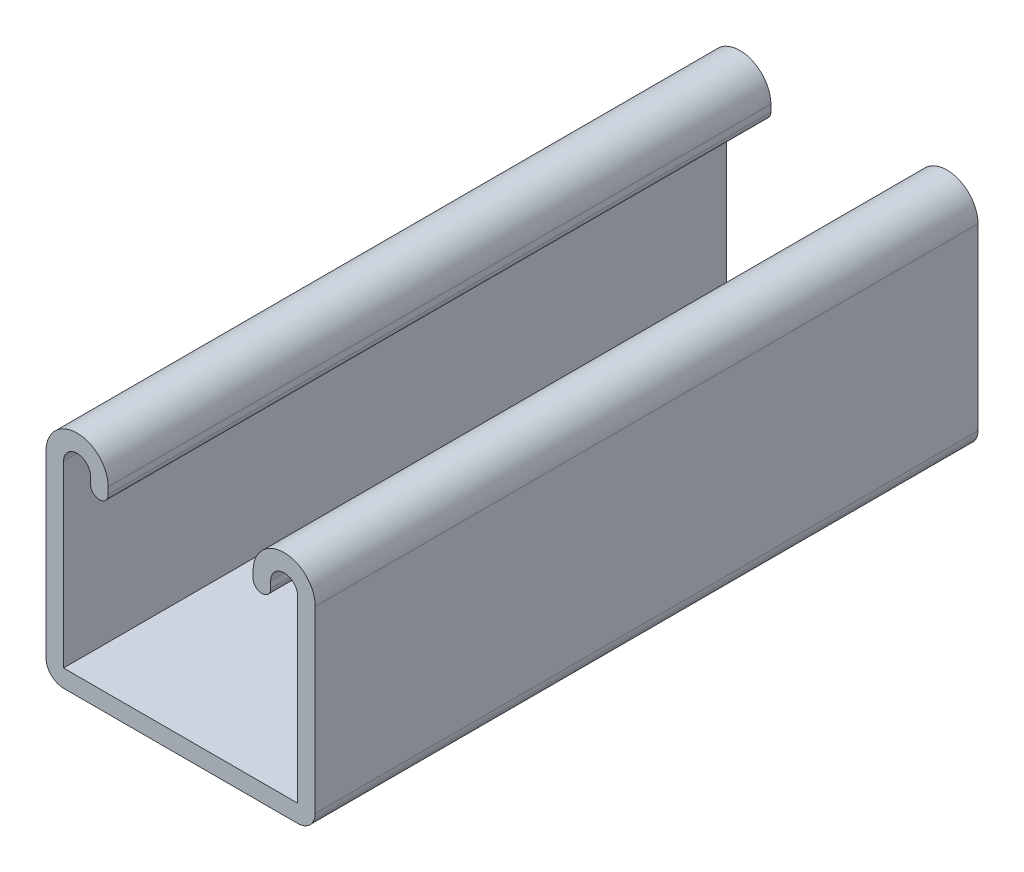
ISO-10303-21;
HEADER;
FILE_DESCRIPTION(('STEP AP214'),'2;1');
FILE_NAME('part.step','',(''),(''),'','','');
FILE_SCHEMA(('AUTOMOTIVE_DESIGN { 1 0 10303 214 1 1 1 1 }'));
ENDSEC;
DATA;
#1=APPLICATION_CONTEXT('core data for automotive mechanical design processes');
#2=APPLICATION_PROTOCOL_DEFINITION('international standard','automotive_design',2000,#1);
#3=PRODUCT_CONTEXT('',#1,'mechanical');
#4=PRODUCT('Part','Part','',(#3));
#5=PRODUCT_RELATED_PRODUCT_CATEGORY('part','',(#4));
#6=PRODUCT_DEFINITION_FORMATION('','',#4);
#7=PRODUCT_DEFINITION_CONTEXT('part definition',#1,'design');
#8=PRODUCT_DEFINITION('design','',#6,#7);
#9=PRODUCT_DEFINITION_SHAPE('','',#8);
#10=(LENGTH_UNIT() NAMED_UNIT(*) SI_UNIT(.MILLI.,.METRE.));
#11=(NAMED_UNIT(*) PLANE_ANGLE_UNIT() SI_UNIT($,.RADIAN.));
#12=(NAMED_UNIT(*) SI_UNIT($,.STERADIAN.) SOLID_ANGLE_UNIT());
#13=UNCERTAINTY_MEASURE_WITH_UNIT(LENGTH_MEASURE(1.E-05),#10,'distance_accuracy_value','');
#14=(GEOMETRIC_REPRESENTATION_CONTEXT(3) GLOBAL_UNCERTAINTY_ASSIGNED_CONTEXT((#13)) GLOBAL_UNIT_ASSIGNED_CONTEXT((#10,
#11,#12)) REPRESENTATION_CONTEXT('',''));
#15=CARTESIAN_POINT('',(0.,0.,0.));
#16=DIRECTION('',(0.,0.,1.));
#17=DIRECTION('',(1.,0.,0.));
#18=AXIS2_PLACEMENT_3D('',#15,#16,#17);
#19=CARTESIAN_POINT('',(-15.875,15.1511,101.6));
#20=DIRECTION('',(0.,0.,-1.));
#21=DIRECTION('',(-1.,0.,0.));
#22=AXIS2_PLACEMENT_3D('',#19,#20,#21);
#23=CYLINDRICAL_SURFACE('',#22,4.7625);
#24=CARTESIAN_POINT('',(-15.875,15.1511,0.));
#25=DIRECTION('',(0.,0.,1.));
#26=DIRECTION('',(-1.,0.,0.));
#27=AXIS2_PLACEMENT_3D('',#24,#25,#26);
#28=CIRCLE('',#27,4.7625);
#29=CARTESIAN_POINT('',(-11.1125,15.1511,0.));
#30=VERTEX_POINT('',#29);
#31=CARTESIAN_POINT('',(-20.6375,15.1511,0.));
#32=VERTEX_POINT('',#31);
#33=EDGE_CURVE('E189',#30,#32,#28,.T.);
#34=ORIENTED_EDGE('',*,*,#33,.T.);
#35=DIRECTION('',(0.,0.,-1.));
#36=VECTOR('',#35,1.);
#37=CARTESIAN_POINT('',(-20.6375,15.1511,101.6));
#38=LINE('',#37,#36);
#39=CARTESIAN_POINT('',(-20.6375,15.1511,101.6));
#40=VERTEX_POINT('',#39);
#41=EDGE_CURVE('E11',#40,#32,#38,.T.);
#42=ORIENTED_EDGE('',*,*,#41,.F.);
#43=CARTESIAN_POINT('',(-15.875,15.1511,101.6));
#44=DIRECTION('',(0.,0.,1.));
#45=DIRECTION('',(-1.,0.,0.));
#46=AXIS2_PLACEMENT_3D('',#43,#44,#45);
#47=CIRCLE('',#46,4.7625);
#48=CARTESIAN_POINT('',(-11.1125,15.1511,101.6));
#49=VERTEX_POINT('',#48);
#50=EDGE_CURVE('E223',#49,#40,#47,.T.);
#51=ORIENTED_EDGE('',*,*,#50,.F.);
#52=DIRECTION('',(0.,0.,-1.));
#53=VECTOR('',#52,1.);
#54=CARTESIAN_POINT('',(-11.1125,15.1511,101.6));
#55=LINE('',#54,#53);
#56=EDGE_CURVE('E185',#49,#30,#55,.T.);
#57=ORIENTED_EDGE('',*,*,#56,.T.);
#58=EDGE_LOOP('',(#34,#42,#51,#57));
#59=FACE_BOUND('',#58,.T.);
#60=ADVANCED_FACE('F32',(#59),#23,.T.);
#61=CARTESIAN_POINT('',(-20.6375,15.1511,101.6));
#62=DIRECTION('',(1.,0.,0.));
#63=DIRECTION('',(0.,1.,0.));
#64=AXIS2_PLACEMENT_3D('',#61,#62,#63);
#65=PLANE('',#64);
#66=DIRECTION('',(0.,-1.,0.));
#67=VECTOR('',#66,1.);
#68=CARTESIAN_POINT('',(-20.6375,15.1511,0.));
#69=LINE('',#68,#67);
#70=CARTESIAN_POINT('',(-20.6375,-12.319,0.));
#71=VERTEX_POINT('',#70);
#72=EDGE_CURVE('E192',#32,#71,#69,.T.);
#73=ORIENTED_EDGE('',*,*,#72,.T.);
#74=DIRECTION('',(0.,0.,-1.));
#75=VECTOR('',#74,1.);
#76=CARTESIAN_POINT('',(-20.6375,-12.319,101.6));
#77=LINE('',#76,#75);
#78=CARTESIAN_POINT('',(-20.6375,-12.319,101.6));
#79=VERTEX_POINT('',#78);
#80=EDGE_CURVE('E41',#79,#71,#77,.T.);
#81=ORIENTED_EDGE('',*,*,#80,.F.);
#82=DIRECTION('',(0.,-1.,0.));
#83=VECTOR('',#82,1.);
#84=CARTESIAN_POINT('',(-20.6375,15.1511,101.6));
#85=LINE('',#84,#83);
#86=EDGE_CURVE('E122',#40,#79,#85,.T.);
#87=ORIENTED_EDGE('',*,*,#86,.F.);
#88=ORIENTED_EDGE('',*,*,#41,.T.);
#89=EDGE_LOOP('',(#73,#81,#87,#88));
#90=FACE_BOUND('',#89,.T.);
#91=ADVANCED_FACE('F332',(#90),#65,.F.);
#92=CARTESIAN_POINT('',(-17.9451,-12.319,101.6));
#93=DIRECTION('',(0.,0.,-1.));
#94=DIRECTION('',(-1.,0.,0.));
#95=AXIS2_PLACEMENT_3D('',#92,#93,#94);
#96=CYLINDRICAL_SURFACE('',#95,2.6924);
#97=CARTESIAN_POINT('',(-17.9451,-12.319,0.));
#98=DIRECTION('',(0.,0.,1.));
#99=DIRECTION('',(-1.,0.,0.));
#100=AXIS2_PLACEMENT_3D('',#97,#98,#99);
#101=CIRCLE('',#100,2.6924);
#102=CARTESIAN_POINT('',(-17.9451,-15.0114,0.));
#103=VERTEX_POINT('',#102);
#104=EDGE_CURVE('E194',#71,#103,#101,.T.);
#105=ORIENTED_EDGE('',*,*,#104,.T.);
#106=DIRECTION('',(0.,0.,-1.));
#107=VECTOR('',#106,1.);
#108=CARTESIAN_POINT('',(-17.9451,-15.0114,101.6));
#109=LINE('',#108,#107);
#110=CARTESIAN_POINT('',(-17.9451,-15.0114,101.6));
#111=VERTEX_POINT('',#110);
#112=EDGE_CURVE('E260',#111,#103,#109,.T.);
#113=ORIENTED_EDGE('',*,*,#112,.F.);
#114=CARTESIAN_POINT('',(-17.9451,-12.319,101.6));
#115=DIRECTION('',(0.,0.,1.));
#116=DIRECTION('',(-1.,0.,0.));
#117=AXIS2_PLACEMENT_3D('',#114,#115,#116);
#118=CIRCLE('',#117,2.6924);
#119=EDGE_CURVE('E269',#79,#111,#118,.T.);
#120=ORIENTED_EDGE('',*,*,#119,.F.);
#121=ORIENTED_EDGE('',*,*,#80,.T.);
#122=EDGE_LOOP('',(#105,#113,#120,#121));
#123=FACE_BOUND('',#122,.T.);
#124=ADVANCED_FACE('F267',(#123),#96,.T.);
#125=CARTESIAN_POINT('',(-17.9451,-15.0114,101.6));
#126=DIRECTION('',(0.,1.,0.));
#127=DIRECTION('',(-1.,0.,0.));
#128=AXIS2_PLACEMENT_3D('',#125,#126,#127);
#129=PLANE('',#128);
#130=CARTESIAN_POINT('',(0.,-15.0114,71.4375));
#131=DIRECTION('',(0.,-1.,0.));
#132=DIRECTION('',(1.,0.,0.));
#133=AXIS2_PLACEMENT_3D('',#130,#131,#132);
#134=CIRCLE('',#133,7.14375);
#135=CARTESIAN_POINT('',(7.14375,-15.0114,71.4375));
#136=VERTEX_POINT('',#135);
#137=EDGE_CURVE('E451',#136,#136,#134,.T.);
#138=ORIENTED_EDGE('',*,*,#137,.F.);
#139=EDGE_LOOP('',(#138));
#140=FACE_BOUND('',#139,.T.);
#141=CARTESIAN_POINT('',(0.,-15.0114,23.8125));
#142=DIRECTION('',(0.,-1.,0.));
#143=DIRECTION('',(1.,0.,0.));
#144=AXIS2_PLACEMENT_3D('',#141,#142,#143);
#145=CIRCLE('',#144,7.14375);
#146=CARTESIAN_POINT('',(7.14375,-15.0114,23.8125));
#147=VERTEX_POINT('',#146);
#148=EDGE_CURVE('E455',#147,#147,#145,.T.);
#149=ORIENTED_EDGE('',*,*,#148,.F.);
#150=EDGE_LOOP('',(#149));
#151=FACE_BOUND('',#150,.T.);
#152=DIRECTION('',(1.,0.,0.));
#153=VECTOR('',#152,1.);
#154=CARTESIAN_POINT('',(-17.9451,-15.0114,0.));
#155=LINE('',#154,#153);
#156=CARTESIAN_POINT('',(17.9451,-15.0114,0.));
#157=VERTEX_POINT('',#156);
#158=EDGE_CURVE('E196',#103,#157,#155,.T.);
#159=ORIENTED_EDGE('',*,*,#158,.T.);
#160=DIRECTION('',(0.,0.,-1.));
#161=VECTOR('',#160,1.);
#162=CARTESIAN_POINT('',(17.9451,-15.0114,101.6));
#163=LINE('',#162,#161);
#164=CARTESIAN_POINT('',(17.9451,-15.0114,101.6));
#165=VERTEX_POINT('',#164);
#166=EDGE_CURVE('E257',#165,#157,#163,.T.);
#167=ORIENTED_EDGE('',*,*,#166,.F.);
#168=DIRECTION('',(1.,0.,0.));
#169=VECTOR('',#168,1.);
#170=CARTESIAN_POINT('',(-17.9451,-15.0114,101.6));
#171=LINE('',#170,#169);
#172=EDGE_CURVE('E287',#111,#165,#171,.T.);
#173=ORIENTED_EDGE('',*,*,#172,.F.);
#174=ORIENTED_EDGE('',*,*,#112,.T.);
#175=EDGE_LOOP('',(#159,#167,#173,#174));
#176=FACE_BOUND('',#175,.T.);
#177=ADVANCED_FACE('F278',(#140,#151,#176),#129,.F.);
#178=CARTESIAN_POINT('',(17.9451,-12.319,101.6));
#179=DIRECTION('',(0.,0.,-1.));
#180=DIRECTION('',(-1.,0.,0.));
#181=AXIS2_PLACEMENT_3D('',#178,#179,#180);
#182=CYLINDRICAL_SURFACE('',#181,2.6924);
#183=CARTESIAN_POINT('',(17.9451,-12.319,0.));
#184=DIRECTION('',(0.,0.,1.));
#185=DIRECTION('',(1.,0.,0.));
#186=AXIS2_PLACEMENT_3D('',#183,#184,#185);
#187=CIRCLE('',#186,2.6924);
#188=CARTESIAN_POINT('',(20.6375,-12.319,0.));
#189=VERTEX_POINT('',#188);
#190=EDGE_CURVE('E198',#157,#189,#187,.T.);
#191=ORIENTED_EDGE('',*,*,#190,.T.);
#192=DIRECTION('',(0.,0.,-1.));
#193=VECTOR('',#192,1.);
#194=CARTESIAN_POINT('',(20.6375,-12.319,101.6));
#195=LINE('',#194,#193);
#196=CARTESIAN_POINT('',(20.6375,-12.319,101.6));
#197=VERTEX_POINT('',#196);
#198=EDGE_CURVE('E254',#197,#189,#195,.T.);
#199=ORIENTED_EDGE('',*,*,#198,.F.);
#200=CARTESIAN_POINT('',(17.9451,-12.319,101.6));
#201=DIRECTION('',(0.,0.,1.));
#202=DIRECTION('',(1.,0.,0.));
#203=AXIS2_PLACEMENT_3D('',#200,#201,#202);
#204=CIRCLE('',#203,2.6924);
#205=EDGE_CURVE('E284',#165,#197,#204,.T.);
#206=ORIENTED_EDGE('',*,*,#205,.F.);
#207=ORIENTED_EDGE('',*,*,#166,.T.);
#208=EDGE_LOOP('',(#191,#199,#206,#207));
#209=FACE_BOUND('',#208,.T.);
#210=ADVANCED_FACE('F282',(#209),#182,.T.);
#211=CARTESIAN_POINT('',(20.6375,-12.319,101.6));
#212=DIRECTION('',(-1.,0.,0.));
#213=DIRECTION('',(0.,0.,1.));
#214=AXIS2_PLACEMENT_3D('',#211,#212,#213);
#215=PLANE('',#214);
#216=DIRECTION('',(0.,1.,0.));
#217=VECTOR('',#216,1.);
#218=CARTESIAN_POINT('',(20.6375,-12.319,0.));
#219=LINE('',#218,#217);
#220=CARTESIAN_POINT('',(20.6375,15.1511,0.));
#221=VERTEX_POINT('',#220);
#222=EDGE_CURVE('E200',#189,#221,#219,.T.);
#223=ORIENTED_EDGE('',*,*,#222,.T.);
#224=DIRECTION('',(0.,0.,-1.));
#225=VECTOR('',#224,1.);
#226=CARTESIAN_POINT('',(20.6375,15.1511,101.6));
#227=LINE('',#226,#225);
#228=CARTESIAN_POINT('',(20.6375,15.1511,101.6));
#229=VERTEX_POINT('',#228);
#230=EDGE_CURVE('E251',#229,#221,#227,.T.);
#231=ORIENTED_EDGE('',*,*,#230,.F.);
#232=DIRECTION('',(0.,1.,0.));
#233=VECTOR('',#232,1.);
#234=CARTESIAN_POINT('',(20.6375,-12.319,101.6));
#235=LINE('',#234,#233);
#236=EDGE_CURVE('E286',#197,#229,#235,.T.);
#237=ORIENTED_EDGE('',*,*,#236,.F.);
#238=ORIENTED_EDGE('',*,*,#198,.T.);
#239=EDGE_LOOP('',(#223,#231,#237,#238));
#240=FACE_BOUND('',#239,.T.);
#241=ADVANCED_FACE('F346',(#240),#215,.F.);
#242=CARTESIAN_POINT('',(15.875,15.1511,101.6));
#243=DIRECTION('',(0.,0.,-1.));
#244=DIRECTION('',(-1.,0.,0.));
#245=AXIS2_PLACEMENT_3D('',#242,#243,#244);
#246=CYLINDRICAL_SURFACE('',#245,4.7625);
#247=CARTESIAN_POINT('',(15.875,15.1511,0.));
#248=DIRECTION('',(0.,0.,1.));
#249=DIRECTION('',(1.,0.,0.));
#250=AXIS2_PLACEMENT_3D('',#247,#248,#249);
#251=CIRCLE('',#250,4.7625);
#252=CARTESIAN_POINT('',(11.1125,15.1511,0.));
#253=VERTEX_POINT('',#252);
#254=EDGE_CURVE('E202',#221,#253,#251,.T.);
#255=ORIENTED_EDGE('',*,*,#254,.T.);
#256=DIRECTION('',(0.,0.,-1.));
#257=VECTOR('',#256,1.);
#258=CARTESIAN_POINT('',(11.1125,15.1511,101.6));
#259=LINE('',#258,#257);
#260=CARTESIAN_POINT('',(11.1125,15.1511,101.6));
#261=VERTEX_POINT('',#260);
#262=EDGE_CURVE('E248',#261,#253,#259,.T.);
#263=ORIENTED_EDGE('',*,*,#262,.F.);
#264=CARTESIAN_POINT('',(15.875,15.1511,101.6));
#265=DIRECTION('',(0.,0.,1.));
#266=DIRECTION('',(1.,0.,0.));
#267=AXIS2_PLACEMENT_3D('',#264,#265,#266);
#268=CIRCLE('',#267,4.7625);
#269=EDGE_CURVE('E289',#229,#261,#268,.T.);
#270=ORIENTED_EDGE('',*,*,#269,.F.);
#271=ORIENTED_EDGE('',*,*,#230,.T.);
#272=EDGE_LOOP('',(#255,#263,#270,#271));
#273=FACE_BOUND('',#272,.T.);
#274=ADVANCED_FACE('F349',(#273),#246,.T.);
#275=CARTESIAN_POINT('',(11.1125,15.1511,101.6));
#276=DIRECTION('',(1.,0.,0.));
#277=DIRECTION('',(0.,1.,0.));
#278=AXIS2_PLACEMENT_3D('',#275,#276,#277);
#279=PLANE('',#278);
#280=DIRECTION('',(0.,-1.,0.));
#281=VECTOR('',#280,1.);
#282=CARTESIAN_POINT('',(11.1125,15.1511,0.));
#283=LINE('',#282,#281);
#284=CARTESIAN_POINT('',(11.1125,14.11605,0.));
#285=VERTEX_POINT('',#284);
#286=EDGE_CURVE('E204',#253,#285,#283,.T.);
#287=ORIENTED_EDGE('',*,*,#286,.T.);
#288=DIRECTION('',(0.,0.,-1.));
#289=VECTOR('',#288,1.);
#290=CARTESIAN_POINT('',(11.1125,14.11605,101.6));
#291=LINE('',#290,#289);
#292=CARTESIAN_POINT('',(11.1125,14.11605,101.6));
#293=VERTEX_POINT('',#292);
#294=EDGE_CURVE('E245',#293,#285,#291,.T.);
#295=ORIENTED_EDGE('',*,*,#294,.F.);
#296=DIRECTION('',(0.,-1.,0.));
#297=VECTOR('',#296,1.);
#298=CARTESIAN_POINT('',(11.1125,15.1511,101.6));
#299=LINE('',#298,#297);
#300=EDGE_CURVE('E295',#261,#293,#299,.T.);
#301=ORIENTED_EDGE('',*,*,#300,.F.);
#302=ORIENTED_EDGE('',*,*,#262,.T.);
#303=EDGE_LOOP('',(#287,#295,#301,#302));
#304=FACE_BOUND('',#303,.T.);
#305=ADVANCED_FACE('F353',(#304),#279,.F.);
#306=CARTESIAN_POINT('',(12.4587,14.11605,101.6));
#307=DIRECTION('',(0.,0.,-1.));
#308=DIRECTION('',(-1.,0.,0.));
#309=AXIS2_PLACEMENT_3D('',#306,#307,#308);
#310=CYLINDRICAL_SURFACE('',#309,1.3462);
#311=CARTESIAN_POINT('',(12.4587,14.11605,0.));
#312=DIRECTION('',(0.,0.,1.));
#313=DIRECTION('',(1.,0.,0.));
#314=AXIS2_PLACEMENT_3D('',#311,#312,#313);
#315=CIRCLE('',#314,1.3462);
#316=CARTESIAN_POINT('',(13.8049,14.11605,0.));
#317=VERTEX_POINT('',#316);
#318=EDGE_CURVE('E206',#285,#317,#315,.T.);
#319=ORIENTED_EDGE('',*,*,#318,.T.);
#320=DIRECTION('',(0.,0.,-1.));
#321=VECTOR('',#320,1.);
#322=CARTESIAN_POINT('',(13.8049,14.11605,101.6));
#323=LINE('',#322,#321);
#324=CARTESIAN_POINT('',(13.8049,14.11605,101.6));
#325=VERTEX_POINT('',#324);
#326=EDGE_CURVE('E242',#325,#317,#323,.T.);
#327=ORIENTED_EDGE('',*,*,#326,.F.);
#328=CARTESIAN_POINT('',(12.4587,14.11605,101.6));
#329=DIRECTION('',(0.,0.,1.));
#330=DIRECTION('',(1.,0.,0.));
#331=AXIS2_PLACEMENT_3D('',#328,#329,#330);
#332=CIRCLE('',#331,1.3462);
#333=EDGE_CURVE('E297',#293,#325,#332,.T.);
#334=ORIENTED_EDGE('',*,*,#333,.F.);
#335=ORIENTED_EDGE('',*,*,#294,.T.);
#336=EDGE_LOOP('',(#319,#327,#334,#335));
#337=FACE_BOUND('',#336,.T.);
#338=ADVANCED_FACE('F357',(#337),#310,.T.);
#339=CARTESIAN_POINT('',(13.8049,15.1511,101.6));
#340=DIRECTION('',(-1.,0.,0.));
#341=DIRECTION('',(0.,0.,1.));
#342=AXIS2_PLACEMENT_3D('',#339,#340,#341);
#343=PLANE('',#342);
#344=DIRECTION('',(0.,1.,0.));
#345=VECTOR('',#344,1.);
#346=CARTESIAN_POINT('',(13.8049,15.1511,0.));
#347=LINE('',#346,#345);
#348=CARTESIAN_POINT('',(13.8049,15.1511,0.));
#349=VERTEX_POINT('',#348);
#350=EDGE_CURVE('E208',#317,#349,#347,.T.);
#351=ORIENTED_EDGE('',*,*,#350,.T.);
#352=DIRECTION('',(0.,0.,-1.));
#353=VECTOR('',#352,1.);
#354=CARTESIAN_POINT('',(13.8049,15.1511,101.6));
#355=LINE('',#354,#353);
#356=CARTESIAN_POINT('',(13.8049,15.1511,101.6));
#357=VERTEX_POINT('',#356);
#358=EDGE_CURVE('E239',#357,#349,#355,.T.);
#359=ORIENTED_EDGE('',*,*,#358,.F.);
#360=DIRECTION('',(0.,1.,0.));
#361=VECTOR('',#360,1.);
#362=CARTESIAN_POINT('',(13.8049,15.1511,101.6));
#363=LINE('',#362,#361);
#364=EDGE_CURVE('E299',#325,#357,#363,.T.);
#365=ORIENTED_EDGE('',*,*,#364,.F.);
#366=ORIENTED_EDGE('',*,*,#326,.T.);
#367=EDGE_LOOP('',(#351,#359,#365,#366));
#368=FACE_BOUND('',#367,.T.);
#369=ADVANCED_FACE('F361',(#368),#343,.F.);
#370=CARTESIAN_POINT('',(15.875,15.1511,101.6));
#371=DIRECTION('',(0.,0.,-1.));
#372=DIRECTION('',(-1.,0.,0.));
#373=AXIS2_PLACEMENT_3D('',#370,#371,#372);
#374=CYLINDRICAL_SURFACE('',#373,2.0701);
#375=CARTESIAN_POINT('',(15.875,15.1511,0.));
#376=DIRECTION('',(0.,0.,-1.));
#377=DIRECTION('',(1.,0.,0.));
#378=AXIS2_PLACEMENT_3D('',#375,#376,#377);
#379=CIRCLE('',#378,2.0701);
#380=CARTESIAN_POINT('',(17.9451,15.1511,0.));
#381=VERTEX_POINT('',#380);
#382=EDGE_CURVE('E210',#349,#381,#379,.T.);
#383=ORIENTED_EDGE('',*,*,#382,.T.);
#384=DIRECTION('',(0.,0.,-1.));
#385=VECTOR('',#384,1.);
#386=CARTESIAN_POINT('',(17.9451,15.1511,101.6));
#387=LINE('',#386,#385);
#388=CARTESIAN_POINT('',(17.9451,15.1511,101.6));
#389=VERTEX_POINT('',#388);
#390=EDGE_CURVE('E236',#389,#381,#387,.T.);
#391=ORIENTED_EDGE('',*,*,#390,.F.);
#392=CARTESIAN_POINT('',(15.875,15.1511,101.6));
#393=DIRECTION('',(0.,0.,-1.));
#394=DIRECTION('',(1.,0.,0.));
#395=AXIS2_PLACEMENT_3D('',#392,#393,#394);
#396=CIRCLE('',#395,2.0701);
#397=EDGE_CURVE('E301',#357,#389,#396,.T.);
#398=ORIENTED_EDGE('',*,*,#397,.F.);
#399=ORIENTED_EDGE('',*,*,#358,.T.);
#400=EDGE_LOOP('',(#383,#391,#398,#399));
#401=FACE_BOUND('',#400,.T.);
#402=ADVANCED_FACE('F365',(#401),#374,.F.);
#403=CARTESIAN_POINT('',(17.9451,-12.319,101.6));
#404=DIRECTION('',(1.,0.,0.));
#405=DIRECTION('',(0.,1.,0.));
#406=AXIS2_PLACEMENT_3D('',#403,#404,#405);
#407=PLANE('',#406);
#408=DIRECTION('',(0.,-1.,0.));
#409=VECTOR('',#408,1.);
#410=CARTESIAN_POINT('',(17.9451,-12.319,0.));
#411=LINE('',#410,#409);
#412=CARTESIAN_POINT('',(17.9451,-12.319,0.));
#413=VERTEX_POINT('',#412);
#414=EDGE_CURVE('E212',#381,#413,#411,.T.);
#415=ORIENTED_EDGE('',*,*,#414,.T.);
#416=DIRECTION('',(0.,0.,-1.));
#417=VECTOR('',#416,1.);
#418=CARTESIAN_POINT('',(17.9451,-12.319,101.6));
#419=LINE('',#418,#417);
#420=CARTESIAN_POINT('',(17.9451,-12.319,101.6));
#421=VERTEX_POINT('',#420);
#422=EDGE_CURVE('E233',#421,#413,#419,.T.);
#423=ORIENTED_EDGE('',*,*,#422,.F.);
#424=DIRECTION('',(0.,-1.,0.));
#425=VECTOR('',#424,1.);
#426=CARTESIAN_POINT('',(17.9451,-12.319,101.6));
#427=LINE('',#426,#425);
#428=EDGE_CURVE('E303',#389,#421,#427,.T.);
#429=ORIENTED_EDGE('',*,*,#428,.F.);
#430=ORIENTED_EDGE('',*,*,#390,.T.);
#431=EDGE_LOOP('',(#415,#423,#429,#430));
#432=FACE_BOUND('',#431,.T.);
#433=ADVANCED_FACE('F369',(#432),#407,.F.);
#434=CARTESIAN_POINT('',(-17.9451,-12.319,101.6));
#435=DIRECTION('',(0.,-1.,0.));
#436=DIRECTION('',(0.,0.,-1.));
#437=AXIS2_PLACEMENT_3D('',#434,#435,#436);
#438=PLANE('',#437);
#439=CARTESIAN_POINT('',(0.,-12.319,71.4375));
#440=DIRECTION('',(0.,-1.,0.));
#441=DIRECTION('',(0.,0.,-1.));
#442=AXIS2_PLACEMENT_3D('',#439,#440,#441);
#443=CIRCLE('',#442,7.14375);
#444=CARTESIAN_POINT('',(0.,-12.319,64.29375));
#445=VERTEX_POINT('',#444);
#446=EDGE_CURVE('E454',#445,#445,#443,.T.);
#447=ORIENTED_EDGE('',*,*,#446,.T.);
#448=EDGE_LOOP('',(#447));
#449=FACE_BOUND('',#448,.T.);
#450=CARTESIAN_POINT('',(0.,-12.319,23.8125));
#451=DIRECTION('',(0.,-1.,0.));
#452=DIRECTION('',(0.,0.,-1.));
#453=AXIS2_PLACEMENT_3D('',#450,#451,#452);
#454=CIRCLE('',#453,7.14375);
#455=CARTESIAN_POINT('',(0.,-12.319,16.66875));
#456=VERTEX_POINT('',#455);
#457=EDGE_CURVE('E35',#456,#456,#454,.T.);
#458=ORIENTED_EDGE('',*,*,#457,.T.);
#459=EDGE_LOOP('',(#458));
#460=FACE_BOUND('',#459,.T.);
#461=DIRECTION('',(-1.,0.,0.));
#462=VECTOR('',#461,1.);
#463=CARTESIAN_POINT('',(-17.9451,-12.319,0.));
#464=LINE('',#463,#462);
#465=CARTESIAN_POINT('',(-17.9451,-12.319,0.));
#466=VERTEX_POINT('',#465);
#467=EDGE_CURVE('E214',#413,#466,#464,.T.);
#468=ORIENTED_EDGE('',*,*,#467,.T.);
#469=DIRECTION('',(0.,0.,-1.));
#470=VECTOR('',#469,1.);
#471=CARTESIAN_POINT('',(-17.9451,-12.319,101.6));
#472=LINE('',#471,#470);
#473=CARTESIAN_POINT('',(-17.9451,-12.319,101.6));
#474=VERTEX_POINT('',#473);
#475=EDGE_CURVE('E230',#474,#466,#472,.T.);
#476=ORIENTED_EDGE('',*,*,#475,.F.);
#477=DIRECTION('',(-1.,0.,0.));
#478=VECTOR('',#477,1.);
#479=CARTESIAN_POINT('',(-17.9451,-12.319,101.6));
#480=LINE('',#479,#478);
#481=EDGE_CURVE('E305',#421,#474,#480,.T.);
#482=ORIENTED_EDGE('',*,*,#481,.F.);
#483=ORIENTED_EDGE('',*,*,#422,.T.);
#484=EDGE_LOOP('',(#468,#476,#482,#483));
#485=FACE_BOUND('',#484,.T.);
#486=ADVANCED_FACE('F373',(#449,#460,#485),#438,.F.);
#487=CARTESIAN_POINT('',(-17.9451,15.1511,101.6));
#488=DIRECTION('',(-1.,0.,0.));
#489=DIRECTION('',(0.,0.,1.));
#490=AXIS2_PLACEMENT_3D('',#487,#488,#489);
#491=PLANE('',#490);
#492=DIRECTION('',(0.,1.,0.));
#493=VECTOR('',#492,1.);
#494=CARTESIAN_POINT('',(-17.9451,15.1511,0.));
#495=LINE('',#494,#493);
#496=CARTESIAN_POINT('',(-17.9451,15.1511,0.));
#497=VERTEX_POINT('',#496);
#498=EDGE_CURVE('E216',#466,#497,#495,.T.);
#499=ORIENTED_EDGE('',*,*,#498,.T.);
#500=DIRECTION('',(0.,0.,-1.));
#501=VECTOR('',#500,1.);
#502=CARTESIAN_POINT('',(-17.9451,15.1511,101.6));
#503=LINE('',#502,#501);
#504=CARTESIAN_POINT('',(-17.9451,15.1511,101.6));
#505=VERTEX_POINT('',#504);
#506=EDGE_CURVE('E227',#505,#497,#503,.T.);
#507=ORIENTED_EDGE('',*,*,#506,.F.);
#508=DIRECTION('',(0.,1.,0.));
#509=VECTOR('',#508,1.);
#510=CARTESIAN_POINT('',(-17.9451,15.1511,101.6));
#511=LINE('',#510,#509);
#512=EDGE_CURVE('E307',#474,#505,#511,.T.);
#513=ORIENTED_EDGE('',*,*,#512,.F.);
#514=ORIENTED_EDGE('',*,*,#475,.T.);
#515=EDGE_LOOP('',(#499,#507,#513,#514));
#516=FACE_BOUND('',#515,.T.);
#517=ADVANCED_FACE('F313',(#516),#491,.F.);
#518=CARTESIAN_POINT('',(-15.875,15.1511,101.6));
#519=DIRECTION('',(0.,0.,-1.));
#520=DIRECTION('',(-1.,0.,0.));
#521=AXIS2_PLACEMENT_3D('',#518,#519,#520);
#522=CYLINDRICAL_SURFACE('',#521,2.0701);
#523=CARTESIAN_POINT('',(-15.875,15.1511,0.));
#524=DIRECTION('',(0.,0.,-1.));
#525=DIRECTION('',(-1.,0.,0.));
#526=AXIS2_PLACEMENT_3D('',#523,#524,#525);
#527=CIRCLE('',#526,2.0701);
#528=CARTESIAN_POINT('',(-13.8049,15.1511,0.));
#529=VERTEX_POINT('',#528);
#530=EDGE_CURVE('E218',#497,#529,#527,.T.);
#531=ORIENTED_EDGE('',*,*,#530,.T.);
#532=DIRECTION('',(0.,0.,-1.));
#533=VECTOR('',#532,1.);
#534=CARTESIAN_POINT('',(-13.8049,15.1511,101.6));
#535=LINE('',#534,#533);
#536=CARTESIAN_POINT('',(-13.8049,15.1511,101.6));
#537=VERTEX_POINT('',#536);
#538=EDGE_CURVE('E180',#537,#529,#535,.T.);
#539=ORIENTED_EDGE('',*,*,#538,.F.);
#540=CARTESIAN_POINT('',(-15.875,15.1511,101.6));
#541=DIRECTION('',(0.,0.,-1.));
#542=DIRECTION('',(-1.,0.,0.));
#543=AXIS2_PLACEMENT_3D('',#540,#541,#542);
#544=CIRCLE('',#543,2.0701);
#545=EDGE_CURVE('E171',#505,#537,#544,.T.);
#546=ORIENTED_EDGE('',*,*,#545,.F.);
#547=ORIENTED_EDGE('',*,*,#506,.T.);
#548=EDGE_LOOP('',(#531,#539,#546,#547));
#549=FACE_BOUND('',#548,.T.);
#550=ADVANCED_FACE('F317',(#549),#522,.F.);
#551=CARTESIAN_POINT('',(-13.8049,15.1511,101.6));
#552=DIRECTION('',(1.,0.,0.));
#553=DIRECTION('',(0.,1.,0.));
#554=AXIS2_PLACEMENT_3D('',#551,#552,#553);
#555=PLANE('',#554);
#556=DIRECTION('',(0.,-1.,0.));
#557=VECTOR('',#556,1.);
#558=CARTESIAN_POINT('',(-13.8049,15.1511,0.));
#559=LINE('',#558,#557);
#560=CARTESIAN_POINT('',(-13.8049,14.11605,0.));
#561=VERTEX_POINT('',#560);
#562=EDGE_CURVE('E179',#529,#561,#559,.T.);
#563=ORIENTED_EDGE('',*,*,#562,.T.);
#564=DIRECTION('',(0.,0.,-1.));
#565=VECTOR('',#564,1.);
#566=CARTESIAN_POINT('',(-13.8049,14.11605,101.6));
#567=LINE('',#566,#565);
#568=CARTESIAN_POINT('',(-13.8049,14.11605,101.6));
#569=VERTEX_POINT('',#568);
#570=EDGE_CURVE('E176',#569,#561,#567,.T.);
#571=ORIENTED_EDGE('',*,*,#570,.F.);
#572=DIRECTION('',(0.,-1.,0.));
#573=VECTOR('',#572,1.);
#574=CARTESIAN_POINT('',(-13.8049,15.1511,101.6));
#575=LINE('',#574,#573);
#576=EDGE_CURVE('E165',#537,#569,#575,.T.);
#577=ORIENTED_EDGE('',*,*,#576,.F.);
#578=ORIENTED_EDGE('',*,*,#538,.T.);
#579=EDGE_LOOP('',(#563,#571,#577,#578));
#580=FACE_BOUND('',#579,.T.);
#581=ADVANCED_FACE('F177',(#580),#555,.F.);
#582=CARTESIAN_POINT('',(-12.4587,14.11605,101.6));
#583=DIRECTION('',(0.,0.,-1.));
#584=DIRECTION('',(-1.,0.,0.));
#585=AXIS2_PLACEMENT_3D('',#582,#583,#584);
#586=CYLINDRICAL_SURFACE('',#585,1.3462);
#587=CARTESIAN_POINT('',(-12.4587,14.11605,0.));
#588=DIRECTION('',(0.,0.,1.));
#589=DIRECTION('',(-1.,0.,0.));
#590=AXIS2_PLACEMENT_3D('',#587,#588,#589);
#591=CIRCLE('',#590,1.3462);
#592=CARTESIAN_POINT('',(-11.1125,14.11605,0.));
#593=VERTEX_POINT('',#592);
#594=EDGE_CURVE('E108',#561,#593,#591,.T.);
#595=ORIENTED_EDGE('',*,*,#594,.T.);
#596=DIRECTION('',(0.,0.,-1.));
#597=VECTOR('',#596,1.);
#598=CARTESIAN_POINT('',(-11.1125,14.11605,101.6));
#599=LINE('',#598,#597);
#600=CARTESIAN_POINT('',(-11.1125,14.11605,101.6));
#601=VERTEX_POINT('',#600);
#602=EDGE_CURVE('E181',#601,#593,#599,.T.);
#603=ORIENTED_EDGE('',*,*,#602,.F.);
#604=CARTESIAN_POINT('',(-12.4587,14.11605,101.6));
#605=DIRECTION('',(0.,0.,1.));
#606=DIRECTION('',(-1.,0.,0.));
#607=AXIS2_PLACEMENT_3D('',#604,#605,#606);
#608=CIRCLE('',#607,1.3462);
#609=EDGE_CURVE('E169',#569,#601,#608,.T.);
#610=ORIENTED_EDGE('',*,*,#609,.F.);
#611=ORIENTED_EDGE('',*,*,#570,.T.);
#612=EDGE_LOOP('',(#595,#603,#610,#611));
#613=FACE_BOUND('',#612,.T.);
#614=ADVANCED_FACE('F183',(#613),#586,.T.);
#615=CARTESIAN_POINT('',(-11.1125,15.1511,101.6));
#616=DIRECTION('',(-1.,0.,0.));
#617=DIRECTION('',(0.,0.,1.));
#618=AXIS2_PLACEMENT_3D('',#615,#616,#617);
#619=PLANE('',#618);
#620=DIRECTION('',(0.,1.,0.));
#621=VECTOR('',#620,1.);
#622=CARTESIAN_POINT('',(-11.1125,15.1511,0.));
#623=LINE('',#622,#621);
#624=EDGE_CURVE('E114',#593,#30,#623,.T.);
#625=ORIENTED_EDGE('',*,*,#624,.T.);
#626=ORIENTED_EDGE('',*,*,#56,.F.);
#627=DIRECTION('',(0.,1.,0.));
#628=VECTOR('',#627,1.);
#629=CARTESIAN_POINT('',(-11.1125,15.1511,101.6));
#630=LINE('',#629,#628);
#631=EDGE_CURVE('E49',#601,#49,#630,.T.);
#632=ORIENTED_EDGE('',*,*,#631,.F.);
#633=ORIENTED_EDGE('',*,*,#602,.T.);
#634=EDGE_LOOP('',(#625,#626,#632,#633));
#635=FACE_BOUND('',#634,.T.);
#636=ADVANCED_FACE('F321',(#635),#619,.F.);
#637=CARTESIAN_POINT('',(-15.875,15.1511,101.6));
#638=DIRECTION('',(0.,0.,-1.));
#639=DIRECTION('',(-1.,0.,0.));
#640=AXIS2_PLACEMENT_3D('',#637,#638,#639);
#641=PLANE('',#640);
#642=ORIENTED_EDGE('',*,*,#50,.T.);
#643=ORIENTED_EDGE('',*,*,#86,.T.);
#644=ORIENTED_EDGE('',*,*,#119,.T.);
#645=ORIENTED_EDGE('',*,*,#172,.T.);
#646=ORIENTED_EDGE('',*,*,#205,.T.);
#647=ORIENTED_EDGE('',*,*,#236,.T.);
#648=ORIENTED_EDGE('',*,*,#269,.T.);
#649=ORIENTED_EDGE('',*,*,#300,.T.);
#650=ORIENTED_EDGE('',*,*,#333,.T.);
#651=ORIENTED_EDGE('',*,*,#364,.T.);
#652=ORIENTED_EDGE('',*,*,#397,.T.);
#653=ORIENTED_EDGE('',*,*,#428,.T.);
#654=ORIENTED_EDGE('',*,*,#481,.T.);
#655=ORIENTED_EDGE('',*,*,#512,.T.);
#656=ORIENTED_EDGE('',*,*,#545,.T.);
#657=ORIENTED_EDGE('',*,*,#576,.T.);
#658=ORIENTED_EDGE('',*,*,#609,.T.);
#659=ORIENTED_EDGE('',*,*,#631,.T.);
#660=EDGE_LOOP('',(#642,#643,#644,#645,#646,#647,#648,#649,#650,#651,#652,#653,#654,#655,#656,
#657,#658,#659));
#661=FACE_BOUND('',#660,.T.);
#662=ADVANCED_FACE('F167',(#661),#641,.F.);
#663=CARTESIAN_POINT('',(-15.875,15.1511,0.));
#664=DIRECTION('',(0.,0.,-1.));
#665=DIRECTION('',(-1.,0.,0.));
#666=AXIS2_PLACEMENT_3D('',#663,#664,#665);
#667=PLANE('',#666);
#668=ORIENTED_EDGE('',*,*,#33,.F.);
#669=ORIENTED_EDGE('',*,*,#624,.F.);
#670=ORIENTED_EDGE('',*,*,#594,.F.);
#671=ORIENTED_EDGE('',*,*,#562,.F.);
#672=ORIENTED_EDGE('',*,*,#530,.F.);
#673=ORIENTED_EDGE('',*,*,#498,.F.);
#674=ORIENTED_EDGE('',*,*,#467,.F.);
#675=ORIENTED_EDGE('',*,*,#414,.F.);
#676=ORIENTED_EDGE('',*,*,#382,.F.);
#677=ORIENTED_EDGE('',*,*,#350,.F.);
#678=ORIENTED_EDGE('',*,*,#318,.F.);
#679=ORIENTED_EDGE('',*,*,#286,.F.);
#680=ORIENTED_EDGE('',*,*,#254,.F.);
#681=ORIENTED_EDGE('',*,*,#222,.F.);
#682=ORIENTED_EDGE('',*,*,#190,.F.);
#683=ORIENTED_EDGE('',*,*,#158,.F.);
#684=ORIENTED_EDGE('',*,*,#104,.F.);
#685=ORIENTED_EDGE('',*,*,#72,.F.);
#686=EDGE_LOOP('',(#668,#669,#670,#671,#672,#673,#674,#675,#676,#677,#678,#679,#680,#681,#682,
#683,#684,#685));
#687=FACE_BOUND('',#686,.T.);
#688=ADVANCED_FACE('F273',(#687),#667,.T.);
#689=CARTESIAN_POINT('',(0.,19.9136,23.8125));
#690=DIRECTION('',(0.,-1.,0.));
#691=DIRECTION('',(1.,0.,0.));
#692=AXIS2_PLACEMENT_3D('',#689,#690,#691);
#693=CYLINDRICAL_SURFACE('',#692,7.14375);
#694=ORIENTED_EDGE('',*,*,#148,.T.);
#695=EDGE_LOOP('',(#694));
#696=FACE_BOUND('',#695,.T.);
#697=ORIENTED_EDGE('',*,*,#457,.F.);
#698=EDGE_LOOP('',(#697));
#699=FACE_BOUND('',#698,.T.);
#700=ADVANCED_FACE('F410',(#696,#699),#693,.F.);
#701=CARTESIAN_POINT('',(0.,19.9136,71.4375));
#702=DIRECTION('',(0.,-1.,0.));
#703=DIRECTION('',(1.,0.,0.));
#704=AXIS2_PLACEMENT_3D('',#701,#702,#703);
#705=CYLINDRICAL_SURFACE('',#704,7.14375);
#706=ORIENTED_EDGE('',*,*,#137,.T.);
#707=EDGE_LOOP('',(#706));
#708=FACE_BOUND('',#707,.T.);
#709=ORIENTED_EDGE('',*,*,#446,.F.);
#710=EDGE_LOOP('',(#709));
#711=FACE_BOUND('',#710,.T.);
#712=ADVANCED_FACE('F418',(#708,#711),#705,.F.);
#713=CLOSED_SHELL('',(#60,#91,#124,#177,#210,#241,#274,#305,#338,#369,#402,#433,#486,#517,#550,
#581,#614,#636,#662,#688,#700,#712));
#714=MANIFOLD_SOLID_BREP('B2',#713);
#715=ADVANCED_BREP_SHAPE_REPRESENTATION('',(#18,#714),#14);
#716=SHAPE_DEFINITION_REPRESENTATION(#9,#715);
ENDSEC;
END-ISO-10303-21;
